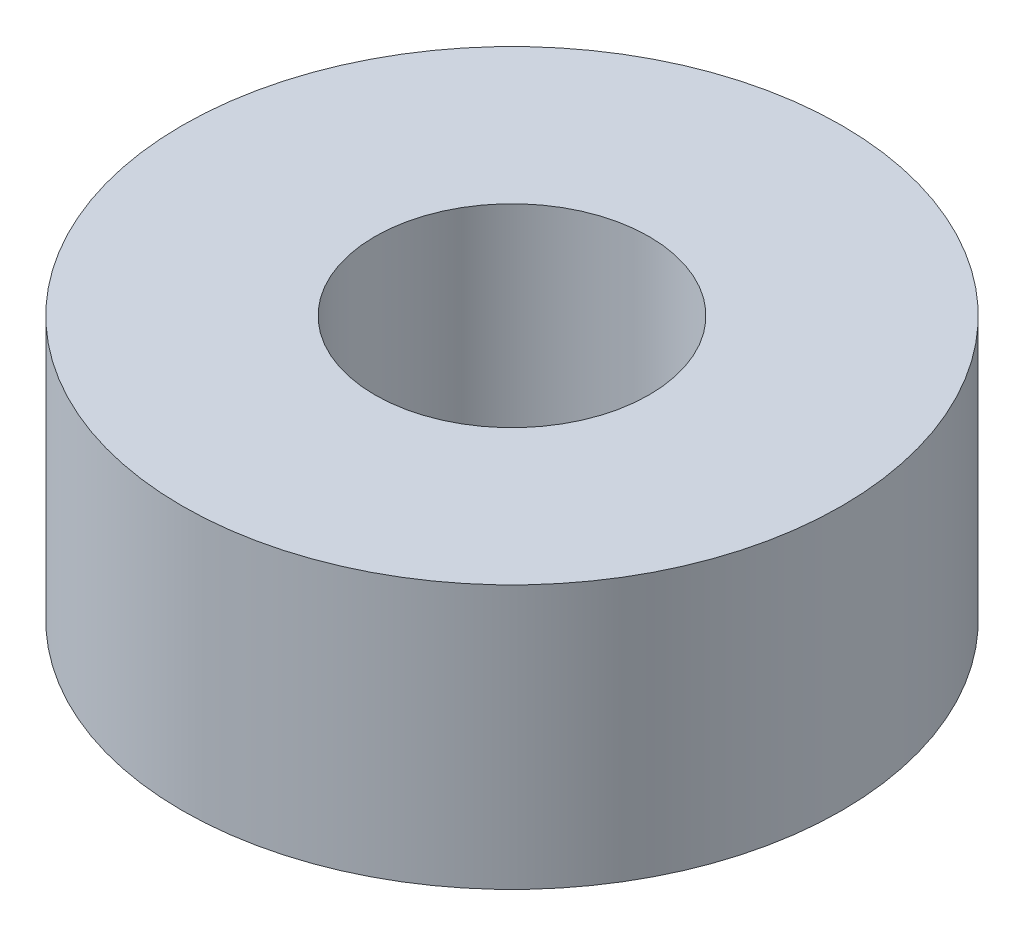
ISO-10303-21;
HEADER;
FILE_DESCRIPTION(('STEP AP214'),'2;1');
FILE_NAME('part.step','',(''),(''),'','','');
FILE_SCHEMA(('AUTOMOTIVE_DESIGN { 1 0 10303 214 1 1 1 1 }'));
ENDSEC;
DATA;
#1=APPLICATION_CONTEXT('core data for automotive mechanical design processes');
#2=APPLICATION_PROTOCOL_DEFINITION('international standard','automotive_design',2000,#1);
#3=PRODUCT_CONTEXT('',#1,'mechanical');
#4=PRODUCT('Part','Part','',(#3));
#5=PRODUCT_RELATED_PRODUCT_CATEGORY('part','',(#4));
#6=PRODUCT_DEFINITION_FORMATION('','',#4);
#7=PRODUCT_DEFINITION_CONTEXT('part definition',#1,'design');
#8=PRODUCT_DEFINITION('design','',#6,#7);
#9=PRODUCT_DEFINITION_SHAPE('','',#8);
#10=(LENGTH_UNIT() NAMED_UNIT(*) SI_UNIT(.MILLI.,.METRE.));
#11=(NAMED_UNIT(*) PLANE_ANGLE_UNIT() SI_UNIT($,.RADIAN.));
#12=(NAMED_UNIT(*) SI_UNIT($,.STERADIAN.) SOLID_ANGLE_UNIT());
#13=UNCERTAINTY_MEASURE_WITH_UNIT(LENGTH_MEASURE(1.E-05),#10,'distance_accuracy_value','');
#14=(GEOMETRIC_REPRESENTATION_CONTEXT(3) GLOBAL_UNCERTAINTY_ASSIGNED_CONTEXT((#13)) GLOBAL_UNIT_ASSIGNED_CONTEXT((#10,
#11,#12)) REPRESENTATION_CONTEXT('',''));
#15=CARTESIAN_POINT('',(0.,0.,0.));
#16=DIRECTION('',(0.,0.,1.));
#17=DIRECTION('',(1.,0.,0.));
#18=AXIS2_PLACEMENT_3D('',#15,#16,#17);
#19=CARTESIAN_POINT('',(0.,6.35,0.));
#20=DIRECTION('',(0.,1.,0.));
#21=DIRECTION('',(0.,0.,1.));
#22=AXIS2_PLACEMENT_3D('',#19,#20,#21);
#23=PLANE('',#22);
#24=CARTESIAN_POINT('',(0.,6.35,0.));
#25=DIRECTION('',(0.,1.,0.));
#26=DIRECTION('',(0.,0.,1.));
#27=AXIS2_PLACEMENT_3D('',#24,#25,#26);
#28=CIRCLE('',#27,7.9375);
#29=CARTESIAN_POINT('',(0.,6.35,7.9375));
#30=VERTEX_POINT('',#29);
#31=EDGE_CURVE('E10',#30,#30,#28,.T.);
#32=ORIENTED_EDGE('',*,*,#31,.T.);
#33=EDGE_LOOP('',(#32));
#34=FACE_BOUND('',#33,.T.);
#35=CARTESIAN_POINT('',(0.,6.35,0.));
#36=DIRECTION('',(0.,1.,0.));
#37=DIRECTION('',(0.,0.,1.));
#38=AXIS2_PLACEMENT_3D('',#35,#36,#37);
#39=CIRCLE('',#38,3.302);
#40=CARTESIAN_POINT('',(0.,6.35,3.302));
#41=VERTEX_POINT('',#40);
#42=EDGE_CURVE('E42',#41,#41,#39,.T.);
#43=ORIENTED_EDGE('',*,*,#42,.F.);
#44=EDGE_LOOP('',(#43));
#45=FACE_BOUND('',#44,.T.);
#46=ADVANCED_FACE('F31',(#34,#45),#23,.T.);
#47=CARTESIAN_POINT('',(0.,0.,0.));
#48=DIRECTION('',(0.,1.,0.));
#49=DIRECTION('',(0.,0.,1.));
#50=AXIS2_PLACEMENT_3D('',#47,#48,#49);
#51=PLANE('',#50);
#52=CARTESIAN_POINT('',(0.,0.,0.));
#53=DIRECTION('',(0.,1.,0.));
#54=DIRECTION('',(0.,0.,1.));
#55=AXIS2_PLACEMENT_3D('',#52,#53,#54);
#56=CIRCLE('',#55,7.9375);
#57=CARTESIAN_POINT('',(0.,0.,7.9375));
#58=VERTEX_POINT('',#57);
#59=EDGE_CURVE('E35',#58,#58,#56,.T.);
#60=ORIENTED_EDGE('',*,*,#59,.F.);
#61=EDGE_LOOP('',(#60));
#62=FACE_BOUND('',#61,.T.);
#63=CARTESIAN_POINT('',(0.,0.,0.));
#64=DIRECTION('',(0.,1.,0.));
#65=DIRECTION('',(0.,0.,1.));
#66=AXIS2_PLACEMENT_3D('',#63,#64,#65);
#67=CIRCLE('',#66,3.302);
#68=CARTESIAN_POINT('',(0.,0.,3.302));
#69=VERTEX_POINT('',#68);
#70=EDGE_CURVE('E44',#69,#69,#67,.T.);
#71=ORIENTED_EDGE('',*,*,#70,.T.);
#72=EDGE_LOOP('',(#71));
#73=FACE_BOUND('',#72,.T.);
#74=ADVANCED_FACE('F54',(#62,#73),#51,.F.);
#75=CARTESIAN_POINT('',(0.,6.35,0.));
#76=DIRECTION('',(0.,-1.,0.));
#77=DIRECTION('',(0.,0.,-1.));
#78=AXIS2_PLACEMENT_3D('',#75,#76,#77);
#79=CYLINDRICAL_SURFACE('',#78,7.9375);
#80=ORIENTED_EDGE('',*,*,#31,.F.);
#81=EDGE_LOOP('',(#80));
#82=FACE_BOUND('',#81,.T.);
#83=ORIENTED_EDGE('',*,*,#59,.T.);
#84=EDGE_LOOP('',(#83));
#85=FACE_BOUND('',#84,.T.);
#86=ADVANCED_FACE('F33',(#82,#85),#79,.T.);
#87=CARTESIAN_POINT('',(0.,6.35,0.));
#88=DIRECTION('',(0.,-1.,0.));
#89=DIRECTION('',(0.,0.,-1.));
#90=AXIS2_PLACEMENT_3D('',#87,#88,#89);
#91=CYLINDRICAL_SURFACE('',#90,3.302);
#92=ORIENTED_EDGE('',*,*,#42,.T.);
#93=EDGE_LOOP('',(#92));
#94=FACE_BOUND('',#93,.T.);
#95=ORIENTED_EDGE('',*,*,#70,.F.);
#96=EDGE_LOOP('',(#95));
#97=FACE_BOUND('',#96,.T.);
#98=ADVANCED_FACE('F50',(#94,#97),#91,.F.);
#99=CLOSED_SHELL('',(#46,#74,#86,#98));
#100=MANIFOLD_SOLID_BREP('B2',#99);
#101=ADVANCED_BREP_SHAPE_REPRESENTATION('',(#18,#100),#14);
#102=SHAPE_DEFINITION_REPRESENTATION(#9,#101);
ENDSEC;
END-ISO-10303-21;
